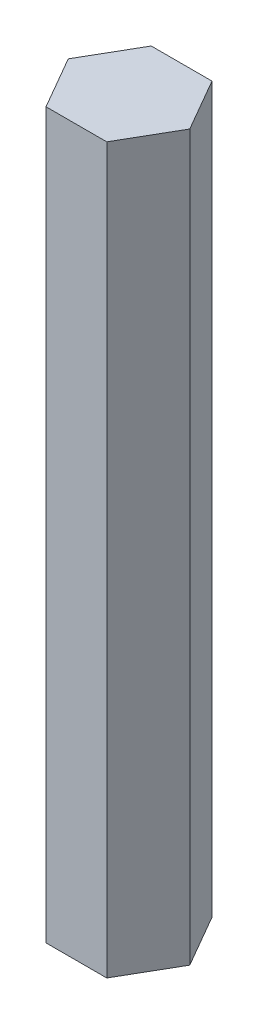
ISO-10303-21;
HEADER;
FILE_DESCRIPTION(('STEP AP214'),'2;1');
FILE_NAME('part.step','',(''),(''),'','','');
FILE_SCHEMA(('AUTOMOTIVE_DESIGN { 1 0 10303 214 1 1 1 1 }'));
ENDSEC;
DATA;
#1=APPLICATION_CONTEXT('core data for automotive mechanical design processes');
#2=APPLICATION_PROTOCOL_DEFINITION('international standard','automotive_design',2000,#1);
#3=PRODUCT_CONTEXT('',#1,'mechanical');
#4=PRODUCT('Part','Part','',(#3));
#5=PRODUCT_RELATED_PRODUCT_CATEGORY('part','',(#4));
#6=PRODUCT_DEFINITION_FORMATION('','',#4);
#7=PRODUCT_DEFINITION_CONTEXT('part definition',#1,'design');
#8=PRODUCT_DEFINITION('design','',#6,#7);
#9=PRODUCT_DEFINITION_SHAPE('','',#8);
#10=(LENGTH_UNIT() NAMED_UNIT(*) SI_UNIT(.MILLI.,.METRE.));
#11=(NAMED_UNIT(*) PLANE_ANGLE_UNIT() SI_UNIT($,.RADIAN.));
#12=(NAMED_UNIT(*) SI_UNIT($,.STERADIAN.) SOLID_ANGLE_UNIT());
#13=UNCERTAINTY_MEASURE_WITH_UNIT(LENGTH_MEASURE(1.E-05),#10,'distance_accuracy_value','');
#14=(GEOMETRIC_REPRESENTATION_CONTEXT(3) GLOBAL_UNCERTAINTY_ASSIGNED_CONTEXT((#13)) GLOBAL_UNIT_ASSIGNED_CONTEXT((#10,
#11,#12)) REPRESENTATION_CONTEXT('',''));
#15=CARTESIAN_POINT('',(0.,0.,0.));
#16=DIRECTION('',(0.,0.,1.));
#17=DIRECTION('',(1.,0.,0.));
#18=AXIS2_PLACEMENT_3D('',#15,#16,#17);
#19=CARTESIAN_POINT('',(4.195,-50.,0.));
#20=DIRECTION('',(0.866025403784439,0.,-0.5));
#21=DIRECTION('',(-0.5,0.,-0.866025403784439));
#22=AXIS2_PLACEMENT_3D('',#19,#20,#21);
#23=PLANE('',#22);
#24=DIRECTION('',(-0.5,0.,-0.866025403784439));
#25=VECTOR('',#24,1.);
#26=CARTESIAN_POINT('',(4.195,0.,0.));
#27=LINE('',#26,#25);
#28=CARTESIAN_POINT('',(4.195,0.,0.));
#29=VERTEX_POINT('',#28);
#30=CARTESIAN_POINT('',(2.0975,0.,-3.63297656887572));
#31=VERTEX_POINT('',#30);
#32=EDGE_CURVE('E118',#29,#31,#27,.T.);
#33=ORIENTED_EDGE('',*,*,#32,.F.);
#34=DIRECTION('',(0.,1.,0.));
#35=VECTOR('',#34,1.);
#36=CARTESIAN_POINT('',(4.195,-50.,0.));
#37=LINE('',#36,#35);
#38=CARTESIAN_POINT('',(4.195,-50.,0.));
#39=VERTEX_POINT('',#38);
#40=EDGE_CURVE('E11',#39,#29,#37,.T.);
#41=ORIENTED_EDGE('',*,*,#40,.F.);
#42=DIRECTION('',(-0.5,0.,-0.866025403784439));
#43=VECTOR('',#42,1.);
#44=CARTESIAN_POINT('',(4.195,-50.,0.));
#45=LINE('',#44,#43);
#46=CARTESIAN_POINT('',(2.0975,-50.,-3.63297656887572));
#47=VERTEX_POINT('',#46);
#48=EDGE_CURVE('E132',#39,#47,#45,.T.);
#49=ORIENTED_EDGE('',*,*,#48,.T.);
#50=DIRECTION('',(0.,1.,0.));
#51=VECTOR('',#50,1.);
#52=CARTESIAN_POINT('',(2.0975,-50.,-3.63297656887572));
#53=LINE('',#52,#51);
#54=EDGE_CURVE('E36',#47,#31,#53,.T.);
#55=ORIENTED_EDGE('',*,*,#54,.T.);
#56=EDGE_LOOP('',(#33,#41,#49,#55));
#57=FACE_BOUND('',#56,.T.);
#58=ADVANCED_FACE('F33',(#57),#23,.T.);
#59=CARTESIAN_POINT('',(2.0975,-50.,3.63297656887572));
#60=DIRECTION('',(0.866025403784439,0.,0.5));
#61=DIRECTION('',(0.5,0.,-0.866025403784439));
#62=AXIS2_PLACEMENT_3D('',#59,#60,#61);
#63=PLANE('',#62);
#64=DIRECTION('',(0.5,0.,-0.866025403784439));
#65=VECTOR('',#64,1.);
#66=CARTESIAN_POINT('',(2.0975,0.,3.63297656887572));
#67=LINE('',#66,#65);
#68=CARTESIAN_POINT('',(2.0975,0.,3.63297656887572));
#69=VERTEX_POINT('',#68);
#70=EDGE_CURVE('E130',#69,#29,#67,.T.);
#71=ORIENTED_EDGE('',*,*,#70,.F.);
#72=DIRECTION('',(0.,1.,0.));
#73=VECTOR('',#72,1.);
#74=CARTESIAN_POINT('',(2.0975,-50.,3.63297656887572));
#75=LINE('',#74,#73);
#76=CARTESIAN_POINT('',(2.0975,-50.,3.63297656887572));
#77=VERTEX_POINT('',#76);
#78=EDGE_CURVE('E42',#77,#69,#75,.T.);
#79=ORIENTED_EDGE('',*,*,#78,.F.);
#80=DIRECTION('',(0.5,0.,-0.866025403784439));
#81=VECTOR('',#80,1.);
#82=CARTESIAN_POINT('',(2.0975,-50.,3.63297656887572));
#83=LINE('',#82,#81);
#84=EDGE_CURVE('E108',#77,#39,#83,.T.);
#85=ORIENTED_EDGE('',*,*,#84,.T.);
#86=ORIENTED_EDGE('',*,*,#40,.T.);
#87=EDGE_LOOP('',(#71,#79,#85,#86));
#88=FACE_BOUND('',#87,.T.);
#89=ADVANCED_FACE('F140',(#88),#63,.T.);
#90=CARTESIAN_POINT('',(-2.0975,-50.,3.63297656887572));
#91=DIRECTION('',(0.,0.,1.));
#92=DIRECTION('',(1.,0.,0.));
#93=AXIS2_PLACEMENT_3D('',#90,#91,#92);
#94=PLANE('',#93);
#95=DIRECTION('',(1.,0.,0.));
#96=VECTOR('',#95,1.);
#97=CARTESIAN_POINT('',(-2.0975,0.,3.63297656887572));
#98=LINE('',#97,#96);
#99=CARTESIAN_POINT('',(-2.0975,0.,3.63297656887572));
#100=VERTEX_POINT('',#99);
#101=EDGE_CURVE('E95',#100,#69,#98,.T.);
#102=ORIENTED_EDGE('',*,*,#101,.F.);
#103=DIRECTION('',(0.,1.,0.));
#104=VECTOR('',#103,1.);
#105=CARTESIAN_POINT('',(-2.0975,-50.,3.63297656887572));
#106=LINE('',#105,#104);
#107=CARTESIAN_POINT('',(-2.0975,-50.,3.63297656887572));
#108=VERTEX_POINT('',#107);
#109=EDGE_CURVE('E90',#108,#100,#106,.T.);
#110=ORIENTED_EDGE('',*,*,#109,.F.);
#111=DIRECTION('',(1.,0.,0.));
#112=VECTOR('',#111,1.);
#113=CARTESIAN_POINT('',(-2.0975,-50.,3.63297656887572));
#114=LINE('',#113,#112);
#115=EDGE_CURVE('E93',#108,#77,#114,.T.);
#116=ORIENTED_EDGE('',*,*,#115,.T.);
#117=ORIENTED_EDGE('',*,*,#78,.T.);
#118=EDGE_LOOP('',(#102,#110,#116,#117));
#119=FACE_BOUND('',#118,.T.);
#120=ADVANCED_FACE('F92',(#119),#94,.T.);
#121=CARTESIAN_POINT('',(-4.195,-50.,0.));
#122=DIRECTION('',(-0.866025403784439,0.,0.5));
#123=DIRECTION('',(0.5,0.,0.866025403784439));
#124=AXIS2_PLACEMENT_3D('',#121,#122,#123);
#125=PLANE('',#124);
#126=DIRECTION('',(0.5,0.,0.866025403784439));
#127=VECTOR('',#126,1.);
#128=CARTESIAN_POINT('',(-4.195,0.,0.));
#129=LINE('',#128,#127);
#130=CARTESIAN_POINT('',(-4.195,0.,0.));
#131=VERTEX_POINT('',#130);
#132=EDGE_CURVE('E127',#131,#100,#129,.T.);
#133=ORIENTED_EDGE('',*,*,#132,.F.);
#134=DIRECTION('',(0.,1.,0.));
#135=VECTOR('',#134,1.);
#136=CARTESIAN_POINT('',(-4.195,-50.,0.));
#137=LINE('',#136,#135);
#138=CARTESIAN_POINT('',(-4.195,-50.,0.));
#139=VERTEX_POINT('',#138);
#140=EDGE_CURVE('E100',#139,#131,#137,.T.);
#141=ORIENTED_EDGE('',*,*,#140,.F.);
#142=DIRECTION('',(0.5,0.,0.866025403784439));
#143=VECTOR('',#142,1.);
#144=CARTESIAN_POINT('',(-4.195,-50.,0.));
#145=LINE('',#144,#143);
#146=EDGE_CURVE('E106',#139,#108,#145,.T.);
#147=ORIENTED_EDGE('',*,*,#146,.T.);
#148=ORIENTED_EDGE('',*,*,#109,.T.);
#149=EDGE_LOOP('',(#133,#141,#147,#148));
#150=FACE_BOUND('',#149,.T.);
#151=ADVANCED_FACE('F110',(#150),#125,.T.);
#152=CARTESIAN_POINT('',(-2.0975,-50.,-3.63297656887572));
#153=DIRECTION('',(-0.866025403784439,0.,-0.5));
#154=DIRECTION('',(-0.5,0.,0.866025403784439));
#155=AXIS2_PLACEMENT_3D('',#152,#153,#154);
#156=PLANE('',#155);
#157=DIRECTION('',(-0.5,0.,0.866025403784439));
#158=VECTOR('',#157,1.);
#159=CARTESIAN_POINT('',(-2.0975,0.,-3.63297656887572));
#160=LINE('',#159,#158);
#161=CARTESIAN_POINT('',(-2.0975,0.,-3.63297656887572));
#162=VERTEX_POINT('',#161);
#163=EDGE_CURVE('E124',#162,#131,#160,.T.);
#164=ORIENTED_EDGE('',*,*,#163,.F.);
#165=DIRECTION('',(0.,1.,0.));
#166=VECTOR('',#165,1.);
#167=CARTESIAN_POINT('',(-2.0975,-50.,-3.63297656887572));
#168=LINE('',#167,#166);
#169=CARTESIAN_POINT('',(-2.0975,-50.,-3.63297656887572));
#170=VERTEX_POINT('',#169);
#171=EDGE_CURVE('E135',#170,#162,#168,.T.);
#172=ORIENTED_EDGE('',*,*,#171,.F.);
#173=DIRECTION('',(-0.5,0.,0.866025403784439));
#174=VECTOR('',#173,1.);
#175=CARTESIAN_POINT('',(-2.0975,-50.,-3.63297656887572));
#176=LINE('',#175,#174);
#177=EDGE_CURVE('E111',#170,#139,#176,.T.);
#178=ORIENTED_EDGE('',*,*,#177,.T.);
#179=ORIENTED_EDGE('',*,*,#140,.T.);
#180=EDGE_LOOP('',(#164,#172,#178,#179));
#181=FACE_BOUND('',#180,.T.);
#182=ADVANCED_FACE('F153',(#181),#156,.T.);
#183=CARTESIAN_POINT('',(2.0975,-50.,-3.63297656887572));
#184=DIRECTION('',(0.,0.,-1.));
#185=DIRECTION('',(-1.,0.,0.));
#186=AXIS2_PLACEMENT_3D('',#183,#184,#185);
#187=PLANE('',#186);
#188=DIRECTION('',(-1.,0.,0.));
#189=VECTOR('',#188,1.);
#190=CARTESIAN_POINT('',(2.0975,0.,-3.63297656887572));
#191=LINE('',#190,#189);
#192=EDGE_CURVE('E121',#31,#162,#191,.T.);
#193=ORIENTED_EDGE('',*,*,#192,.F.);
#194=ORIENTED_EDGE('',*,*,#54,.F.);
#195=DIRECTION('',(-1.,0.,0.));
#196=VECTOR('',#195,1.);
#197=CARTESIAN_POINT('',(2.0975,-50.,-3.63297656887572));
#198=LINE('',#197,#196);
#199=EDGE_CURVE('E113',#47,#170,#198,.T.);
#200=ORIENTED_EDGE('',*,*,#199,.T.);
#201=ORIENTED_EDGE('',*,*,#171,.T.);
#202=EDGE_LOOP('',(#193,#194,#200,#201));
#203=FACE_BOUND('',#202,.T.);
#204=ADVANCED_FACE('F137',(#203),#187,.T.);
#205=CARTESIAN_POINT('',(0.,-50.,0.));
#206=DIRECTION('',(0.,1.,0.));
#207=DIRECTION('',(0.,0.,1.));
#208=AXIS2_PLACEMENT_3D('',#205,#206,#207);
#209=PLANE('',#208);
#210=ORIENTED_EDGE('',*,*,#48,.F.);
#211=ORIENTED_EDGE('',*,*,#84,.F.);
#212=ORIENTED_EDGE('',*,*,#115,.F.);
#213=ORIENTED_EDGE('',*,*,#146,.F.);
#214=ORIENTED_EDGE('',*,*,#177,.F.);
#215=ORIENTED_EDGE('',*,*,#199,.F.);
#216=EDGE_LOOP('',(#210,#211,#212,#213,#214,#215));
#217=FACE_BOUND('',#216,.T.);
#218=ADVANCED_FACE('F104',(#217),#209,.F.);
#219=CARTESIAN_POINT('',(0.,0.,0.));
#220=DIRECTION('',(0.,1.,0.));
#221=DIRECTION('',(0.,0.,1.));
#222=AXIS2_PLACEMENT_3D('',#219,#220,#221);
#223=PLANE('',#222);
#224=ORIENTED_EDGE('',*,*,#32,.T.);
#225=ORIENTED_EDGE('',*,*,#192,.T.);
#226=ORIENTED_EDGE('',*,*,#163,.T.);
#227=ORIENTED_EDGE('',*,*,#132,.T.);
#228=ORIENTED_EDGE('',*,*,#101,.T.);
#229=ORIENTED_EDGE('',*,*,#70,.T.);
#230=EDGE_LOOP('',(#224,#225,#226,#227,#228,#229));
#231=FACE_BOUND('',#230,.T.);
#232=ADVANCED_FACE('F139',(#231),#223,.T.);
#233=CLOSED_SHELL('',(#58,#89,#120,#151,#182,#204,#218,#232));
#234=MANIFOLD_SOLID_BREP('B2',#233);
#235=ADVANCED_BREP_SHAPE_REPRESENTATION('',(#18,#234),#14);
#236=SHAPE_DEFINITION_REPRESENTATION(#9,#235);
ENDSEC;
END-ISO-10303-21;
